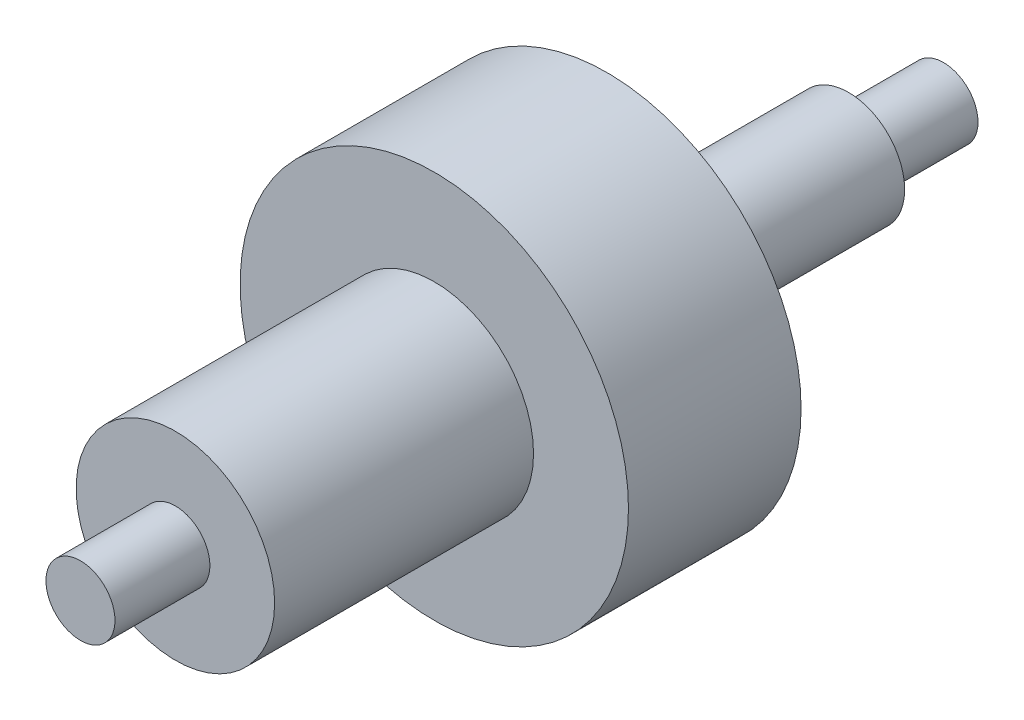
ISO-10303-21;
HEADER;
FILE_DESCRIPTION(('STEP AP214'),'2;1');
FILE_NAME('part.step','',(''),(''),'','','');
FILE_SCHEMA(('AUTOMOTIVE_DESIGN { 1 0 10303 214 1 1 1 1 }'));
ENDSEC;
DATA;
#1=APPLICATION_CONTEXT('core data for automotive mechanical design processes');
#2=APPLICATION_PROTOCOL_DEFINITION('international standard','automotive_design',2000,#1);
#3=PRODUCT_CONTEXT('',#1,'mechanical');
#4=PRODUCT('Part','Part','',(#3));
#5=PRODUCT_RELATED_PRODUCT_CATEGORY('part','',(#4));
#6=PRODUCT_DEFINITION_FORMATION('','',#4);
#7=PRODUCT_DEFINITION_CONTEXT('part definition',#1,'design');
#8=PRODUCT_DEFINITION('design','',#6,#7);
#9=PRODUCT_DEFINITION_SHAPE('','',#8);
#10=(LENGTH_UNIT() NAMED_UNIT(*) SI_UNIT(.MILLI.,.METRE.));
#11=(NAMED_UNIT(*) PLANE_ANGLE_UNIT() SI_UNIT($,.RADIAN.));
#12=(NAMED_UNIT(*) SI_UNIT($,.STERADIAN.) SOLID_ANGLE_UNIT());
#13=UNCERTAINTY_MEASURE_WITH_UNIT(LENGTH_MEASURE(1.E-05),#10,'distance_accuracy_value','');
#14=(GEOMETRIC_REPRESENTATION_CONTEXT(3) GLOBAL_UNCERTAINTY_ASSIGNED_CONTEXT((#13)) GLOBAL_UNIT_ASSIGNED_CONTEXT((#10,
#11,#12)) REPRESENTATION_CONTEXT('',''));
#15=CARTESIAN_POINT('',(0.,0.,0.));
#16=DIRECTION('',(0.,0.,1.));
#17=DIRECTION('',(1.,0.,0.));
#18=AXIS2_PLACEMENT_3D('',#15,#16,#17);
#19=CARTESIAN_POINT('',(0.,0.,1.1));
#20=DIRECTION('',(0.,0.,-1.));
#21=DIRECTION('',(-1.,0.,0.));
#22=AXIS2_PLACEMENT_3D('',#19,#20,#21);
#23=CYLINDRICAL_SURFACE('',#22,0.4);
#24=CARTESIAN_POINT('',(0.,0.,1.1));
#25=DIRECTION('',(0.,0.,1.));
#26=DIRECTION('',(1.,0.,0.));
#27=AXIS2_PLACEMENT_3D('',#24,#25,#26);
#28=CIRCLE('',#27,0.4);
#29=CARTESIAN_POINT('',(0.4,0.,1.1));
#30=VERTEX_POINT('',#29);
#31=EDGE_CURVE('E43',#30,#30,#28,.T.);
#32=ORIENTED_EDGE('',*,*,#31,.F.);
#33=EDGE_LOOP('',(#32));
#34=FACE_BOUND('',#33,.T.);
#35=CARTESIAN_POINT('',(0.,0.,0.));
#36=DIRECTION('',(0.,0.,1.));
#37=DIRECTION('',(1.,0.,0.));
#38=AXIS2_PLACEMENT_3D('',#35,#36,#37);
#39=CIRCLE('',#38,0.4);
#40=CARTESIAN_POINT('',(0.4,0.,0.));
#41=VERTEX_POINT('',#40);
#42=EDGE_CURVE('E34',#41,#41,#39,.T.);
#43=ORIENTED_EDGE('',*,*,#42,.T.);
#44=EDGE_LOOP('',(#43));
#45=FACE_BOUND('',#44,.T.);
#46=ADVANCED_FACE('F31',(#34,#45),#23,.T.);
#47=CARTESIAN_POINT('',(0.,0.,0.));
#48=DIRECTION('',(0.,0.,1.));
#49=DIRECTION('',(1.,0.,0.));
#50=AXIS2_PLACEMENT_3D('',#47,#48,#49);
#51=PLANE('',#50);
#52=ORIENTED_EDGE('',*,*,#42,.F.);
#53=EDGE_LOOP('',(#52));
#54=FACE_BOUND('',#53,.T.);
#55=ADVANCED_FACE('F69',(#54),#51,.F.);
#56=CARTESIAN_POINT('',(0.,0.,3.9));
#57=DIRECTION('',(0.,0.,-1.));
#58=DIRECTION('',(-1.,0.,0.));
#59=AXIS2_PLACEMENT_3D('',#56,#57,#58);
#60=CYLINDRICAL_SURFACE('',#59,0.65);
#61=CARTESIAN_POINT('',(0.,0.,3.9));
#62=DIRECTION('',(0.,0.,1.));
#63=DIRECTION('',(1.,0.,0.));
#64=AXIS2_PLACEMENT_3D('',#61,#62,#63);
#65=CIRCLE('',#64,0.65);
#66=CARTESIAN_POINT('',(0.65,0.,3.9));
#67=VERTEX_POINT('',#66);
#68=EDGE_CURVE('E58',#67,#67,#65,.T.);
#69=ORIENTED_EDGE('',*,*,#68,.F.);
#70=EDGE_LOOP('',(#69));
#71=FACE_BOUND('',#70,.T.);
#72=CARTESIAN_POINT('',(0.,0.,1.1));
#73=DIRECTION('',(0.,0.,1.));
#74=DIRECTION('',(1.,0.,0.));
#75=AXIS2_PLACEMENT_3D('',#72,#73,#74);
#76=CIRCLE('',#75,0.65);
#77=CARTESIAN_POINT('',(0.65,0.,1.1));
#78=VERTEX_POINT('',#77);
#79=EDGE_CURVE('E55',#78,#78,#76,.T.);
#80=ORIENTED_EDGE('',*,*,#79,.T.);
#81=EDGE_LOOP('',(#80));
#82=FACE_BOUND('',#81,.T.);
#83=ADVANCED_FACE('F71',(#71,#82),#60,.T.);
#84=CARTESIAN_POINT('',(0.,0.,1.1));
#85=DIRECTION('',(0.,0.,1.));
#86=DIRECTION('',(1.,0.,0.));
#87=AXIS2_PLACEMENT_3D('',#84,#85,#86);
#88=PLANE('',#87);
#89=ORIENTED_EDGE('',*,*,#31,.T.);
#90=EDGE_LOOP('',(#89));
#91=FACE_BOUND('',#90,.T.);
#92=ORIENTED_EDGE('',*,*,#79,.F.);
#93=EDGE_LOOP('',(#92));
#94=FACE_BOUND('',#93,.T.);
#95=ADVANCED_FACE('F76',(#91,#94),#88,.F.);
#96=CARTESIAN_POINT('',(0.,0.,5.9));
#97=DIRECTION('',(0.,0.,-1.));
#98=DIRECTION('',(-1.,0.,0.));
#99=AXIS2_PLACEMENT_3D('',#96,#97,#98);
#100=CYLINDRICAL_SURFACE('',#99,2.25);
#101=CARTESIAN_POINT('',(0.,0.,5.9));
#102=DIRECTION('',(0.,0.,1.));
#103=DIRECTION('',(1.,0.,0.));
#104=AXIS2_PLACEMENT_3D('',#101,#102,#103);
#105=CIRCLE('',#104,2.25);
#106=CARTESIAN_POINT('',(2.25,0.,5.9));
#107=VERTEX_POINT('',#106);
#108=EDGE_CURVE('E52',#107,#107,#105,.T.);
#109=ORIENTED_EDGE('',*,*,#108,.F.);
#110=EDGE_LOOP('',(#109));
#111=FACE_BOUND('',#110,.T.);
#112=CARTESIAN_POINT('',(0.,0.,3.9));
#113=DIRECTION('',(0.,0.,1.));
#114=DIRECTION('',(1.,0.,0.));
#115=AXIS2_PLACEMENT_3D('',#112,#113,#114);
#116=CIRCLE('',#115,2.25);
#117=CARTESIAN_POINT('',(2.25,0.,3.9));
#118=VERTEX_POINT('',#117);
#119=EDGE_CURVE('E50',#118,#118,#116,.T.);
#120=ORIENTED_EDGE('',*,*,#119,.T.);
#121=EDGE_LOOP('',(#120));
#122=FACE_BOUND('',#121,.T.);
#123=ADVANCED_FACE('F83',(#111,#122),#100,.T.);
#124=CARTESIAN_POINT('',(0.,0.,5.9));
#125=DIRECTION('',(0.,0.,1.));
#126=DIRECTION('',(1.,0.,0.));
#127=AXIS2_PLACEMENT_3D('',#124,#125,#126);
#128=PLANE('',#127);
#129=CARTESIAN_POINT('',(0.,0.,5.9));
#130=DIRECTION('',(0.,0.,1.));
#131=DIRECTION('',(1.,0.,0.));
#132=AXIS2_PLACEMENT_3D('',#129,#130,#131);
#133=CIRCLE('',#132,1.15);
#134=CARTESIAN_POINT('',(1.15,0.,5.9));
#135=VERTEX_POINT('',#134);
#136=EDGE_CURVE('E38',#135,#135,#133,.T.);
#137=ORIENTED_EDGE('',*,*,#136,.F.);
#138=EDGE_LOOP('',(#137));
#139=FACE_BOUND('',#138,.T.);
#140=ORIENTED_EDGE('',*,*,#108,.T.);
#141=EDGE_LOOP('',(#140));
#142=FACE_BOUND('',#141,.T.);
#143=ADVANCED_FACE('F86',(#139,#142),#128,.T.);
#144=CARTESIAN_POINT('',(0.,0.,3.9));
#145=DIRECTION('',(0.,0.,1.));
#146=DIRECTION('',(1.,0.,0.));
#147=AXIS2_PLACEMENT_3D('',#144,#145,#146);
#148=PLANE('',#147);
#149=ORIENTED_EDGE('',*,*,#68,.T.);
#150=EDGE_LOOP('',(#149));
#151=FACE_BOUND('',#150,.T.);
#152=ORIENTED_EDGE('',*,*,#119,.F.);
#153=EDGE_LOOP('',(#152));
#154=FACE_BOUND('',#153,.T.);
#155=ADVANCED_FACE('F88',(#151,#154),#148,.F.);
#156=CARTESIAN_POINT('',(0.,0.,8.9));
#157=DIRECTION('',(0.,0.,-1.));
#158=DIRECTION('',(-1.,0.,0.));
#159=AXIS2_PLACEMENT_3D('',#156,#157,#158);
#160=CYLINDRICAL_SURFACE('',#159,1.15);
#161=CARTESIAN_POINT('',(0.,0.,8.9));
#162=DIRECTION('',(0.,0.,1.));
#163=DIRECTION('',(1.,0.,0.));
#164=AXIS2_PLACEMENT_3D('',#161,#162,#163);
#165=CIRCLE('',#164,1.15);
#166=CARTESIAN_POINT('',(1.15,0.,8.9));
#167=VERTEX_POINT('',#166);
#168=EDGE_CURVE('E48',#167,#167,#165,.T.);
#169=ORIENTED_EDGE('',*,*,#168,.F.);
#170=EDGE_LOOP('',(#169));
#171=FACE_BOUND('',#170,.T.);
#172=ORIENTED_EDGE('',*,*,#136,.T.);
#173=EDGE_LOOP('',(#172));
#174=FACE_BOUND('',#173,.T.);
#175=ADVANCED_FACE('F91',(#171,#174),#160,.T.);
#176=CARTESIAN_POINT('',(0.,0.,8.9));
#177=DIRECTION('',(0.,0.,1.));
#178=DIRECTION('',(1.,0.,0.));
#179=AXIS2_PLACEMENT_3D('',#176,#177,#178);
#180=PLANE('',#179);
#181=CARTESIAN_POINT('',(0.,0.,8.9));
#182=DIRECTION('',(0.,0.,1.));
#183=DIRECTION('',(1.,0.,0.));
#184=AXIS2_PLACEMENT_3D('',#181,#182,#183);
#185=CIRCLE('',#184,0.4);
#186=CARTESIAN_POINT('',(0.4,0.,8.9));
#187=VERTEX_POINT('',#186);
#188=EDGE_CURVE('E10',#187,#187,#185,.T.);
#189=ORIENTED_EDGE('',*,*,#188,.F.);
#190=EDGE_LOOP('',(#189));
#191=FACE_BOUND('',#190,.T.);
#192=ORIENTED_EDGE('',*,*,#168,.T.);
#193=EDGE_LOOP('',(#192));
#194=FACE_BOUND('',#193,.T.);
#195=ADVANCED_FACE('F98',(#191,#194),#180,.T.);
#196=CARTESIAN_POINT('',(0.,0.,10.));
#197=DIRECTION('',(0.,0.,-1.));
#198=DIRECTION('',(-1.,0.,0.));
#199=AXIS2_PLACEMENT_3D('',#196,#197,#198);
#200=CYLINDRICAL_SURFACE('',#199,0.4);
#201=CARTESIAN_POINT('',(0.,0.,10.));
#202=DIRECTION('',(0.,0.,1.));
#203=DIRECTION('',(1.,0.,0.));
#204=AXIS2_PLACEMENT_3D('',#201,#202,#203);
#205=CIRCLE('',#204,0.4);
#206=CARTESIAN_POINT('',(0.4,0.,10.));
#207=VERTEX_POINT('',#206);
#208=EDGE_CURVE('E47',#207,#207,#205,.T.);
#209=ORIENTED_EDGE('',*,*,#208,.F.);
#210=EDGE_LOOP('',(#209));
#211=FACE_BOUND('',#210,.T.);
#212=ORIENTED_EDGE('',*,*,#188,.T.);
#213=EDGE_LOOP('',(#212));
#214=FACE_BOUND('',#213,.T.);
#215=ADVANCED_FACE('F102',(#211,#214),#200,.T.);
#216=CARTESIAN_POINT('',(0.,0.,10.));
#217=DIRECTION('',(0.,0.,1.));
#218=DIRECTION('',(1.,0.,0.));
#219=AXIS2_PLACEMENT_3D('',#216,#217,#218);
#220=PLANE('',#219);
#221=ORIENTED_EDGE('',*,*,#208,.T.);
#222=EDGE_LOOP('',(#221));
#223=FACE_BOUND('',#222,.T.);
#224=ADVANCED_FACE('F106',(#223),#220,.T.);
#225=CLOSED_SHELL('',(#46,#55,#83,#95,#123,#143,#155,#175,#195,#215,#224));
#226=MANIFOLD_SOLID_BREP('B2',#225);
#227=ADVANCED_BREP_SHAPE_REPRESENTATION('',(#18,#226),#14);
#228=SHAPE_DEFINITION_REPRESENTATION(#9,#227);
ENDSEC;
END-ISO-10303-21;
